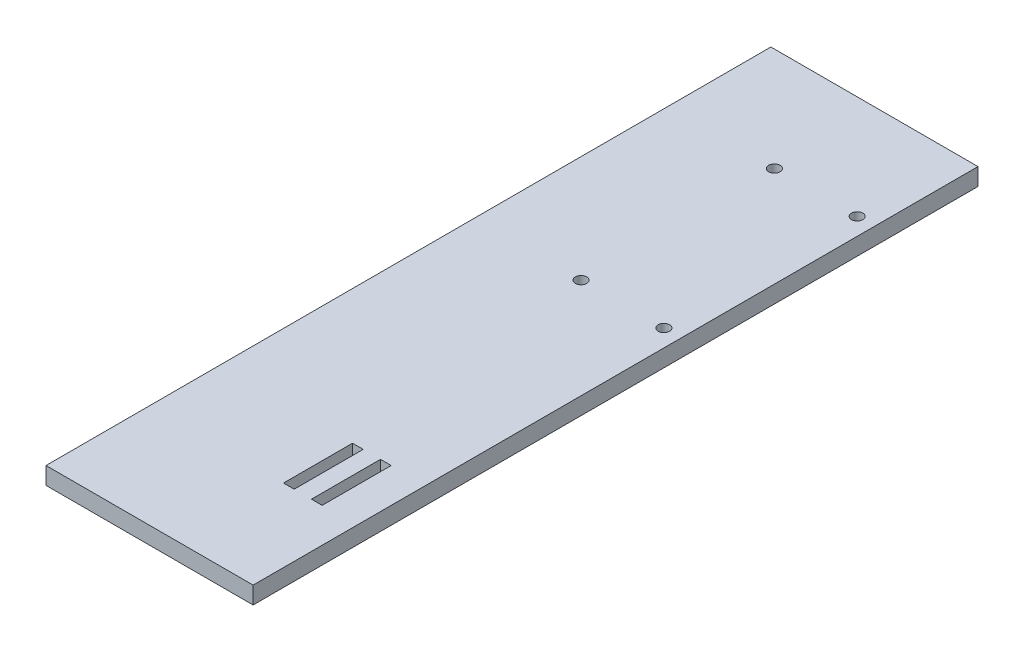
ISO-10303-21;
HEADER;
FILE_DESCRIPTION(('STEP AP214'),'2;1');
FILE_NAME('part.step','',(''),(''),'','','');
FILE_SCHEMA(('AUTOMOTIVE_DESIGN { 1 0 10303 214 1 1 1 1 }'));
ENDSEC;
DATA;
#1=APPLICATION_CONTEXT('core data for automotive mechanical design processes');
#2=APPLICATION_PROTOCOL_DEFINITION('international standard','automotive_design',2000,#1);
#3=PRODUCT_CONTEXT('',#1,'mechanical');
#4=PRODUCT('Part','Part','',(#3));
#5=PRODUCT_RELATED_PRODUCT_CATEGORY('part','',(#4));
#6=PRODUCT_DEFINITION_FORMATION('','',#4);
#7=PRODUCT_DEFINITION_CONTEXT('part definition',#1,'design');
#8=PRODUCT_DEFINITION('design','',#6,#7);
#9=PRODUCT_DEFINITION_SHAPE('','',#8);
#10=(LENGTH_UNIT() NAMED_UNIT(*) SI_UNIT(.MILLI.,.METRE.));
#11=(NAMED_UNIT(*) PLANE_ANGLE_UNIT() SI_UNIT($,.RADIAN.));
#12=(NAMED_UNIT(*) SI_UNIT($,.STERADIAN.) SOLID_ANGLE_UNIT());
#13=UNCERTAINTY_MEASURE_WITH_UNIT(LENGTH_MEASURE(1.E-05),#10,'distance_accuracy_value','');
#14=(GEOMETRIC_REPRESENTATION_CONTEXT(3) GLOBAL_UNCERTAINTY_ASSIGNED_CONTEXT((#13)) GLOBAL_UNIT_ASSIGNED_CONTEXT((#10,
#11,#12)) REPRESENTATION_CONTEXT('',''));
#15=CARTESIAN_POINT('',(0.,0.,0.));
#16=DIRECTION('',(0.,0.,1.));
#17=DIRECTION('',(1.,0.,0.));
#18=AXIS2_PLACEMENT_3D('',#15,#16,#17);
#19=CARTESIAN_POINT('',(0.,5.,0.));
#20=DIRECTION('',(1.,0.,0.));
#21=DIRECTION('',(0.,0.,-1.));
#22=AXIS2_PLACEMENT_3D('',#19,#20,#21);
#23=PLANE('',#22);
#24=DIRECTION('',(0.,0.,1.));
#25=VECTOR('',#24,1.);
#26=CARTESIAN_POINT('',(0.,0.,0.));
#27=LINE('',#26,#25);
#28=CARTESIAN_POINT('',(0.,0.,-210.));
#29=VERTEX_POINT('',#28);
#30=CARTESIAN_POINT('',(0.,0.,0.));
#31=VERTEX_POINT('',#30);
#32=EDGE_CURVE('E177',#29,#31,#27,.T.);
#33=ORIENTED_EDGE('',*,*,#32,.T.);
#34=DIRECTION('',(0.,-1.,0.));
#35=VECTOR('',#34,1.);
#36=CARTESIAN_POINT('',(0.,5.,0.));
#37=LINE('',#36,#35);
#38=CARTESIAN_POINT('',(0.,5.,0.));
#39=VERTEX_POINT('',#38);
#40=EDGE_CURVE('E11',#39,#31,#37,.T.);
#41=ORIENTED_EDGE('',*,*,#40,.F.);
#42=DIRECTION('',(0.,0.,1.));
#43=VECTOR('',#42,1.);
#44=CARTESIAN_POINT('',(0.,5.,0.));
#45=LINE('',#44,#43);
#46=CARTESIAN_POINT('',(0.,5.,-210.));
#47=VERTEX_POINT('',#46);
#48=EDGE_CURVE('E225',#47,#39,#45,.T.);
#49=ORIENTED_EDGE('',*,*,#48,.F.);
#50=DIRECTION('',(0.,-1.,0.));
#51=VECTOR('',#50,1.);
#52=CARTESIAN_POINT('',(0.,5.,-210.));
#53=LINE('',#52,#51);
#54=EDGE_CURVE('E239',#47,#29,#53,.T.);
#55=ORIENTED_EDGE('',*,*,#54,.T.);
#56=EDGE_LOOP('',(#33,#41,#49,#55));
#57=FACE_BOUND('',#56,.T.);
#58=ADVANCED_FACE('F38',(#57),#23,.F.);
#59=CARTESIAN_POINT('',(0.,5.,0.));
#60=DIRECTION('',(0.,0.,-1.));
#61=DIRECTION('',(-1.,0.,0.));
#62=AXIS2_PLACEMENT_3D('',#59,#60,#61);
#63=PLANE('',#62);
#64=DIRECTION('',(1.,0.,0.));
#65=VECTOR('',#64,1.);
#66=CARTESIAN_POINT('',(0.,0.,0.));
#67=LINE('',#66,#65);
#68=CARTESIAN_POINT('',(60.,0.,0.));
#69=VERTEX_POINT('',#68);
#70=EDGE_CURVE('E243',#31,#69,#67,.T.);
#71=ORIENTED_EDGE('',*,*,#70,.T.);
#72=DIRECTION('',(0.,-1.,0.));
#73=VECTOR('',#72,1.);
#74=CARTESIAN_POINT('',(60.,5.,0.));
#75=LINE('',#74,#73);
#76=CARTESIAN_POINT('',(60.,5.,0.));
#77=VERTEX_POINT('',#76);
#78=EDGE_CURVE('E46',#77,#69,#75,.T.);
#79=ORIENTED_EDGE('',*,*,#78,.F.);
#80=DIRECTION('',(1.,0.,0.));
#81=VECTOR('',#80,1.);
#82=CARTESIAN_POINT('',(0.,5.,0.));
#83=LINE('',#82,#81);
#84=EDGE_CURVE('E229',#39,#77,#83,.T.);
#85=ORIENTED_EDGE('',*,*,#84,.F.);
#86=ORIENTED_EDGE('',*,*,#40,.T.);
#87=EDGE_LOOP('',(#71,#79,#85,#86));
#88=FACE_BOUND('',#87,.T.);
#89=ADVANCED_FACE('F278',(#88),#63,.F.);
#90=CARTESIAN_POINT('',(60.,5.,0.));
#91=DIRECTION('',(-1.,0.,0.));
#92=DIRECTION('',(0.,0.,1.));
#93=AXIS2_PLACEMENT_3D('',#90,#91,#92);
#94=PLANE('',#93);
#95=DIRECTION('',(0.,0.,-1.));
#96=VECTOR('',#95,1.);
#97=CARTESIAN_POINT('',(60.,0.,0.));
#98=LINE('',#97,#96);
#99=CARTESIAN_POINT('',(60.,0.,-210.));
#100=VERTEX_POINT('',#99);
#101=EDGE_CURVE('E246',#69,#100,#98,.T.);
#102=ORIENTED_EDGE('',*,*,#101,.T.);
#103=DIRECTION('',(0.,-1.,0.));
#104=VECTOR('',#103,1.);
#105=CARTESIAN_POINT('',(60.,5.,-210.));
#106=LINE('',#105,#104);
#107=CARTESIAN_POINT('',(60.,5.,-210.));
#108=VERTEX_POINT('',#107);
#109=EDGE_CURVE('E254',#108,#100,#106,.T.);
#110=ORIENTED_EDGE('',*,*,#109,.F.);
#111=DIRECTION('',(0.,0.,-1.));
#112=VECTOR('',#111,1.);
#113=CARTESIAN_POINT('',(60.,5.,0.));
#114=LINE('',#113,#112);
#115=EDGE_CURVE('E233',#77,#108,#114,.T.);
#116=ORIENTED_EDGE('',*,*,#115,.F.);
#117=ORIENTED_EDGE('',*,*,#78,.T.);
#118=EDGE_LOOP('',(#102,#110,#116,#117));
#119=FACE_BOUND('',#118,.T.);
#120=ADVANCED_FACE('F263',(#119),#94,.F.);
#121=CARTESIAN_POINT('',(0.,5.,-210.));
#122=DIRECTION('',(0.,0.,1.));
#123=DIRECTION('',(1.,0.,0.));
#124=AXIS2_PLACEMENT_3D('',#121,#122,#123);
#125=PLANE('',#124);
#126=DIRECTION('',(-1.,0.,0.));
#127=VECTOR('',#126,1.);
#128=CARTESIAN_POINT('',(0.,0.,-210.));
#129=LINE('',#128,#127);
#130=EDGE_CURVE('E230',#100,#29,#129,.T.);
#131=ORIENTED_EDGE('',*,*,#130,.T.);
#132=ORIENTED_EDGE('',*,*,#54,.F.);
#133=DIRECTION('',(-1.,0.,0.));
#134=VECTOR('',#133,1.);
#135=CARTESIAN_POINT('',(0.,5.,-210.));
#136=LINE('',#135,#134);
#137=EDGE_CURVE('E236',#108,#47,#136,.T.);
#138=ORIENTED_EDGE('',*,*,#137,.F.);
#139=ORIENTED_EDGE('',*,*,#109,.T.);
#140=EDGE_LOOP('',(#131,#132,#138,#139));
#141=FACE_BOUND('',#140,.T.);
#142=ADVANCED_FACE('F271',(#141),#125,.F.);
#143=CARTESIAN_POINT('',(0.,5.,0.));
#144=DIRECTION('',(0.,-1.,0.));
#145=DIRECTION('',(0.,0.,-1.));
#146=AXIS2_PLACEMENT_3D('',#143,#144,#145);
#147=PLANE('',#146);
#148=CARTESIAN_POINT('',(31.,5.,-180.));
#149=DIRECTION('',(0.,1.,0.));
#150=DIRECTION('',(0.,0.,-1.));
#151=AXIS2_PLACEMENT_3D('',#148,#149,#150);
#152=CIRCLE('',#151,1.65000000000001);
#153=CARTESIAN_POINT('',(31.,5.,-181.65));
#154=VERTEX_POINT('',#153);
#155=EDGE_CURVE('E363',#154,#154,#152,.T.);
#156=ORIENTED_EDGE('',*,*,#155,.F.);
#157=EDGE_LOOP('',(#156));
#158=FACE_BOUND('',#157,.T.);
#159=CARTESIAN_POINT('',(31.,5.,-124.));
#160=DIRECTION('',(0.,1.,0.));
#161=DIRECTION('',(0.,0.,1.));
#162=AXIS2_PLACEMENT_3D('',#159,#160,#161);
#163=CIRCLE('',#162,1.65);
#164=CARTESIAN_POINT('',(31.,5.,-122.35));
#165=VERTEX_POINT('',#164);
#166=EDGE_CURVE('E353',#165,#165,#163,.T.);
#167=ORIENTED_EDGE('',*,*,#166,.F.);
#168=EDGE_LOOP('',(#167));
#169=FACE_BOUND('',#168,.T.);
#170=CARTESIAN_POINT('',(55.,5.,-124.));
#171=DIRECTION('',(0.,1.,0.));
#172=DIRECTION('',(0.,0.,-1.));
#173=AXIS2_PLACEMENT_3D('',#170,#171,#172);
#174=CIRCLE('',#173,1.65);
#175=CARTESIAN_POINT('',(55.,5.,-125.65));
#176=VERTEX_POINT('',#175);
#177=EDGE_CURVE('E344',#176,#176,#174,.T.);
#178=ORIENTED_EDGE('',*,*,#177,.F.);
#179=EDGE_LOOP('',(#178));
#180=FACE_BOUND('',#179,.T.);
#181=CARTESIAN_POINT('',(55.,5.,-180.));
#182=DIRECTION('',(0.,1.,0.));
#183=DIRECTION('',(0.,0.,1.));
#184=AXIS2_PLACEMENT_3D('',#181,#182,#183);
#185=CIRCLE('',#184,1.65000000000001);
#186=CARTESIAN_POINT('',(55.,5.,-178.35));
#187=VERTEX_POINT('',#186);
#188=EDGE_CURVE('E158',#187,#187,#185,.T.);
#189=ORIENTED_EDGE('',*,*,#188,.F.);
#190=EDGE_LOOP('',(#189));
#191=FACE_BOUND('',#190,.T.);
#192=DIRECTION('',(1.,0.,0.));
#193=VECTOR('',#192,1.);
#194=CARTESIAN_POINT('',(46.9,5.,-30.));
#195=LINE('',#194,#193);
#196=CARTESIAN_POINT('',(46.9,5.,-30.));
#197=VERTEX_POINT('',#196);
#198=CARTESIAN_POINT('',(50.,5.,-30.));
#199=VERTEX_POINT('',#198);
#200=EDGE_CURVE('E167',#197,#199,#195,.T.);
#201=ORIENTED_EDGE('',*,*,#200,.F.);
#202=DIRECTION('',(0.,0.,1.));
#203=VECTOR('',#202,1.);
#204=CARTESIAN_POINT('',(46.9,5.,-30.));
#205=LINE('',#204,#203);
#206=CARTESIAN_POINT('',(46.9,5.,-50.));
#207=VERTEX_POINT('',#206);
#208=EDGE_CURVE('E53',#207,#197,#205,.T.);
#209=ORIENTED_EDGE('',*,*,#208,.F.);
#210=DIRECTION('',(-1.,0.,0.));
#211=VECTOR('',#210,1.);
#212=CARTESIAN_POINT('',(46.9,5.,-50.));
#213=LINE('',#212,#211);
#214=CARTESIAN_POINT('',(50.,5.,-50.));
#215=VERTEX_POINT('',#214);
#216=EDGE_CURVE('E151',#215,#207,#213,.T.);
#217=ORIENTED_EDGE('',*,*,#216,.F.);
#218=DIRECTION('',(0.,0.,-1.));
#219=VECTOR('',#218,1.);
#220=CARTESIAN_POINT('',(50.,5.,-30.));
#221=LINE('',#220,#219);
#222=EDGE_CURVE('E155',#199,#215,#221,.T.);
#223=ORIENTED_EDGE('',*,*,#222,.F.);
#224=EDGE_LOOP('',(#201,#209,#217,#223));
#225=FACE_BOUND('',#224,.T.);
#226=DIRECTION('',(1.,0.,0.));
#227=VECTOR('',#226,1.);
#228=CARTESIAN_POINT('',(38.8,5.,-30.));
#229=LINE('',#228,#227);
#230=CARTESIAN_POINT('',(38.8,5.,-30.));
#231=VERTEX_POINT('',#230);
#232=CARTESIAN_POINT('',(41.9,5.,-30.));
#233=VERTEX_POINT('',#232);
#234=EDGE_CURVE('E203',#231,#233,#229,.T.);
#235=ORIENTED_EDGE('',*,*,#234,.F.);
#236=DIRECTION('',(0.,0.,1.));
#237=VECTOR('',#236,1.);
#238=CARTESIAN_POINT('',(38.8,5.,-50.));
#239=LINE('',#238,#237);
#240=CARTESIAN_POINT('',(38.8,5.,-50.));
#241=VERTEX_POINT('',#240);
#242=EDGE_CURVE('E61',#241,#231,#239,.T.);
#243=ORIENTED_EDGE('',*,*,#242,.F.);
#244=DIRECTION('',(-1.,0.,0.));
#245=VECTOR('',#244,1.);
#246=CARTESIAN_POINT('',(38.8,5.,-50.));
#247=LINE('',#246,#245);
#248=CARTESIAN_POINT('',(41.9,5.,-50.));
#249=VERTEX_POINT('',#248);
#250=EDGE_CURVE('E188',#249,#241,#247,.T.);
#251=ORIENTED_EDGE('',*,*,#250,.F.);
#252=DIRECTION('',(0.,0.,-1.));
#253=VECTOR('',#252,1.);
#254=CARTESIAN_POINT('',(41.9,5.,-50.));
#255=LINE('',#254,#253);
#256=EDGE_CURVE('E208',#233,#249,#255,.T.);
#257=ORIENTED_EDGE('',*,*,#256,.F.);
#258=EDGE_LOOP('',(#235,#243,#251,#257));
#259=FACE_BOUND('',#258,.T.);
#260=ORIENTED_EDGE('',*,*,#48,.T.);
#261=ORIENTED_EDGE('',*,*,#84,.T.);
#262=ORIENTED_EDGE('',*,*,#115,.T.);
#263=ORIENTED_EDGE('',*,*,#137,.T.);
#264=EDGE_LOOP('',(#260,#261,#262,#263));
#265=FACE_BOUND('',#264,.T.);
#266=ADVANCED_FACE('F277',(#158,#169,#180,#191,#225,#259,#265),#147,.F.);
#267=CARTESIAN_POINT('',(0.,0.,0.));
#268=DIRECTION('',(0.,-1.,0.));
#269=DIRECTION('',(0.,0.,-1.));
#270=AXIS2_PLACEMENT_3D('',#267,#268,#269);
#271=PLANE('',#270);
#272=CARTESIAN_POINT('',(31.,0.,-180.));
#273=DIRECTION('',(0.,1.,0.));
#274=DIRECTION('',(0.,0.,-1.));
#275=AXIS2_PLACEMENT_3D('',#272,#273,#274);
#276=CIRCLE('',#275,1.65000000000001);
#277=CARTESIAN_POINT('',(31.,0.,-181.65));
#278=VERTEX_POINT('',#277);
#279=EDGE_CURVE('E359',#278,#278,#276,.T.);
#280=ORIENTED_EDGE('',*,*,#279,.T.);
#281=EDGE_LOOP('',(#280));
#282=FACE_BOUND('',#281,.T.);
#283=CARTESIAN_POINT('',(31.,0.,-124.));
#284=DIRECTION('',(0.,1.,0.));
#285=DIRECTION('',(0.,0.,1.));
#286=AXIS2_PLACEMENT_3D('',#283,#284,#285);
#287=CIRCLE('',#286,1.65);
#288=CARTESIAN_POINT('',(31.,0.,-122.35));
#289=VERTEX_POINT('',#288);
#290=EDGE_CURVE('E347',#289,#289,#287,.T.);
#291=ORIENTED_EDGE('',*,*,#290,.T.);
#292=EDGE_LOOP('',(#291));
#293=FACE_BOUND('',#292,.T.);
#294=CARTESIAN_POINT('',(55.,0.,-124.));
#295=DIRECTION('',(0.,1.,0.));
#296=DIRECTION('',(0.,0.,-1.));
#297=AXIS2_PLACEMENT_3D('',#294,#295,#296);
#298=CIRCLE('',#297,1.65);
#299=CARTESIAN_POINT('',(55.,0.,-125.65));
#300=VERTEX_POINT('',#299);
#301=EDGE_CURVE('E341',#300,#300,#298,.T.);
#302=ORIENTED_EDGE('',*,*,#301,.T.);
#303=EDGE_LOOP('',(#302));
#304=FACE_BOUND('',#303,.T.);
#305=CARTESIAN_POINT('',(55.,0.,-180.));
#306=DIRECTION('',(0.,1.,0.));
#307=DIRECTION('',(0.,0.,1.));
#308=AXIS2_PLACEMENT_3D('',#305,#306,#307);
#309=CIRCLE('',#308,1.65000000000001);
#310=CARTESIAN_POINT('',(55.,0.,-178.35));
#311=VERTEX_POINT('',#310);
#312=EDGE_CURVE('E204',#311,#311,#309,.T.);
#313=ORIENTED_EDGE('',*,*,#312,.T.);
#314=EDGE_LOOP('',(#313));
#315=FACE_BOUND('',#314,.T.);
#316=DIRECTION('',(0.,0.,1.));
#317=VECTOR('',#316,1.);
#318=CARTESIAN_POINT('',(46.9,0.,-30.));
#319=LINE('',#318,#317);
#320=CARTESIAN_POINT('',(46.9,0.,-50.));
#321=VERTEX_POINT('',#320);
#322=CARTESIAN_POINT('',(46.9,0.,-30.));
#323=VERTEX_POINT('',#322);
#324=EDGE_CURVE('E129',#321,#323,#319,.T.);
#325=ORIENTED_EDGE('',*,*,#324,.T.);
#326=DIRECTION('',(1.,0.,0.));
#327=VECTOR('',#326,1.);
#328=CARTESIAN_POINT('',(46.9,0.,-30.));
#329=LINE('',#328,#327);
#330=CARTESIAN_POINT('',(50.,0.,-30.));
#331=VERTEX_POINT('',#330);
#332=EDGE_CURVE('E140',#323,#331,#329,.T.);
#333=ORIENTED_EDGE('',*,*,#332,.T.);
#334=DIRECTION('',(0.,0.,-1.));
#335=VECTOR('',#334,1.);
#336=CARTESIAN_POINT('',(50.,0.,-30.));
#337=LINE('',#336,#335);
#338=CARTESIAN_POINT('',(50.,0.,-50.));
#339=VERTEX_POINT('',#338);
#340=EDGE_CURVE('E145',#331,#339,#337,.T.);
#341=ORIENTED_EDGE('',*,*,#340,.T.);
#342=DIRECTION('',(-1.,0.,0.));
#343=VECTOR('',#342,1.);
#344=CARTESIAN_POINT('',(46.9,0.,-50.));
#345=LINE('',#344,#343);
#346=EDGE_CURVE('E136',#339,#321,#345,.T.);
#347=ORIENTED_EDGE('',*,*,#346,.T.);
#348=EDGE_LOOP('',(#325,#333,#341,#347));
#349=FACE_BOUND('',#348,.T.);
#350=DIRECTION('',(0.,0.,1.));
#351=VECTOR('',#350,1.);
#352=CARTESIAN_POINT('',(38.8,0.,-50.));
#353=LINE('',#352,#351);
#354=CARTESIAN_POINT('',(38.8,0.,-50.));
#355=VERTEX_POINT('',#354);
#356=CARTESIAN_POINT('',(38.8,0.,-30.));
#357=VERTEX_POINT('',#356);
#358=EDGE_CURVE('E183',#355,#357,#353,.T.);
#359=ORIENTED_EDGE('',*,*,#358,.T.);
#360=DIRECTION('',(1.,0.,0.));
#361=VECTOR('',#360,1.);
#362=CARTESIAN_POINT('',(38.8,0.,-30.));
#363=LINE('',#362,#361);
#364=CARTESIAN_POINT('',(41.9,0.,-30.));
#365=VERTEX_POINT('',#364);
#366=EDGE_CURVE('E187',#357,#365,#363,.T.);
#367=ORIENTED_EDGE('',*,*,#366,.T.);
#368=DIRECTION('',(0.,0.,-1.));
#369=VECTOR('',#368,1.);
#370=CARTESIAN_POINT('',(41.9,0.,-50.));
#371=LINE('',#370,#369);
#372=CARTESIAN_POINT('',(41.9,0.,-50.));
#373=VERTEX_POINT('',#372);
#374=EDGE_CURVE('E192',#365,#373,#371,.T.);
#375=ORIENTED_EDGE('',*,*,#374,.T.);
#376=DIRECTION('',(-1.,0.,0.));
#377=VECTOR('',#376,1.);
#378=CARTESIAN_POINT('',(38.8,0.,-50.));
#379=LINE('',#378,#377);
#380=EDGE_CURVE('E196',#373,#355,#379,.T.);
#381=ORIENTED_EDGE('',*,*,#380,.T.);
#382=EDGE_LOOP('',(#359,#367,#375,#381));
#383=FACE_BOUND('',#382,.T.);
#384=ORIENTED_EDGE('',*,*,#32,.F.);
#385=ORIENTED_EDGE('',*,*,#130,.F.);
#386=ORIENTED_EDGE('',*,*,#101,.F.);
#387=ORIENTED_EDGE('',*,*,#70,.F.);
#388=EDGE_LOOP('',(#384,#385,#386,#387));
#389=FACE_BOUND('',#388,.T.);
#390=ADVANCED_FACE('F147',(#282,#293,#304,#315,#349,#383,#389),#271,.T.);
#391=CARTESIAN_POINT('',(38.8,0.,-50.));
#392=DIRECTION('',(-1.,0.,0.));
#393=DIRECTION('',(0.,0.,1.));
#394=AXIS2_PLACEMENT_3D('',#391,#392,#393);
#395=PLANE('',#394);
#396=ORIENTED_EDGE('',*,*,#242,.T.);
#397=DIRECTION('',(0.,1.,0.));
#398=VECTOR('',#397,1.);
#399=CARTESIAN_POINT('',(38.8,0.,-30.));
#400=LINE('',#399,#398);
#401=EDGE_CURVE('E200',#357,#231,#400,.T.);
#402=ORIENTED_EDGE('',*,*,#401,.F.);
#403=ORIENTED_EDGE('',*,*,#358,.F.);
#404=DIRECTION('',(0.,1.,0.));
#405=VECTOR('',#404,1.);
#406=CARTESIAN_POINT('',(38.8,0.,-50.));
#407=LINE('',#406,#405);
#408=EDGE_CURVE('E168',#355,#241,#407,.T.);
#409=ORIENTED_EDGE('',*,*,#408,.T.);
#410=EDGE_LOOP('',(#396,#402,#403,#409));
#411=FACE_BOUND('',#410,.T.);
#412=ADVANCED_FACE('F290',(#411),#395,.F.);
#413=CARTESIAN_POINT('',(38.8,0.,-50.));
#414=DIRECTION('',(0.,0.,-1.));
#415=DIRECTION('',(-1.,0.,0.));
#416=AXIS2_PLACEMENT_3D('',#413,#414,#415);
#417=PLANE('',#416);
#418=ORIENTED_EDGE('',*,*,#250,.T.);
#419=ORIENTED_EDGE('',*,*,#408,.F.);
#420=ORIENTED_EDGE('',*,*,#380,.F.);
#421=DIRECTION('',(0.,1.,0.));
#422=VECTOR('',#421,1.);
#423=CARTESIAN_POINT('',(41.9,0.,-50.));
#424=LINE('',#423,#422);
#425=EDGE_CURVE('E217',#373,#249,#424,.T.);
#426=ORIENTED_EDGE('',*,*,#425,.T.);
#427=EDGE_LOOP('',(#418,#419,#420,#426));
#428=FACE_BOUND('',#427,.T.);
#429=ADVANCED_FACE('F297',(#428),#417,.F.);
#430=CARTESIAN_POINT('',(41.9,0.,-50.));
#431=DIRECTION('',(1.,0.,0.));
#432=DIRECTION('',(0.,0.,-1.));
#433=AXIS2_PLACEMENT_3D('',#430,#431,#432);
#434=PLANE('',#433);
#435=ORIENTED_EDGE('',*,*,#256,.T.);
#436=ORIENTED_EDGE('',*,*,#425,.F.);
#437=ORIENTED_EDGE('',*,*,#374,.F.);
#438=DIRECTION('',(0.,1.,0.));
#439=VECTOR('',#438,1.);
#440=CARTESIAN_POINT('',(41.9,0.,-30.));
#441=LINE('',#440,#439);
#442=EDGE_CURVE('E220',#365,#233,#441,.T.);
#443=ORIENTED_EDGE('',*,*,#442,.T.);
#444=EDGE_LOOP('',(#435,#436,#437,#443));
#445=FACE_BOUND('',#444,.T.);
#446=ADVANCED_FACE('F301',(#445),#434,.F.);
#447=CARTESIAN_POINT('',(38.8,0.,-30.));
#448=DIRECTION('',(0.,0.,1.));
#449=DIRECTION('',(1.,0.,0.));
#450=AXIS2_PLACEMENT_3D('',#447,#448,#449);
#451=PLANE('',#450);
#452=ORIENTED_EDGE('',*,*,#234,.T.);
#453=ORIENTED_EDGE('',*,*,#442,.F.);
#454=ORIENTED_EDGE('',*,*,#366,.F.);
#455=ORIENTED_EDGE('',*,*,#401,.T.);
#456=EDGE_LOOP('',(#452,#453,#454,#455));
#457=FACE_BOUND('',#456,.T.);
#458=ADVANCED_FACE('F298',(#457),#451,.F.);
#459=CARTESIAN_POINT('',(46.9,0.,-30.));
#460=DIRECTION('',(-1.,0.,0.));
#461=DIRECTION('',(0.,0.,1.));
#462=AXIS2_PLACEMENT_3D('',#459,#460,#461);
#463=PLANE('',#462);
#464=ORIENTED_EDGE('',*,*,#208,.T.);
#465=DIRECTION('',(0.,1.,0.));
#466=VECTOR('',#465,1.);
#467=CARTESIAN_POINT('',(46.9,0.,-30.));
#468=LINE('',#467,#466);
#469=EDGE_CURVE('E125',#323,#197,#468,.T.);
#470=ORIENTED_EDGE('',*,*,#469,.F.);
#471=ORIENTED_EDGE('',*,*,#324,.F.);
#472=DIRECTION('',(0.,1.,0.));
#473=VECTOR('',#472,1.);
#474=CARTESIAN_POINT('',(46.9,0.,-50.));
#475=LINE('',#474,#473);
#476=EDGE_CURVE('E174',#321,#207,#475,.T.);
#477=ORIENTED_EDGE('',*,*,#476,.T.);
#478=EDGE_LOOP('',(#464,#470,#471,#477));
#479=FACE_BOUND('',#478,.T.);
#480=ADVANCED_FACE('F127',(#479),#463,.F.);
#481=CARTESIAN_POINT('',(46.9,0.,-50.));
#482=DIRECTION('',(0.,0.,-1.));
#483=DIRECTION('',(-1.,0.,0.));
#484=AXIS2_PLACEMENT_3D('',#481,#482,#483);
#485=PLANE('',#484);
#486=ORIENTED_EDGE('',*,*,#216,.T.);
#487=ORIENTED_EDGE('',*,*,#476,.F.);
#488=ORIENTED_EDGE('',*,*,#346,.F.);
#489=DIRECTION('',(0.,1.,0.));
#490=VECTOR('',#489,1.);
#491=CARTESIAN_POINT('',(50.,0.,-50.));
#492=LINE('',#491,#490);
#493=EDGE_CURVE('E178',#339,#215,#492,.T.);
#494=ORIENTED_EDGE('',*,*,#493,.T.);
#495=EDGE_LOOP('',(#486,#487,#488,#494));
#496=FACE_BOUND('',#495,.T.);
#497=ADVANCED_FACE('F311',(#496),#485,.F.);
#498=CARTESIAN_POINT('',(50.,0.,-30.));
#499=DIRECTION('',(1.,0.,0.));
#500=DIRECTION('',(0.,0.,-1.));
#501=AXIS2_PLACEMENT_3D('',#498,#499,#500);
#502=PLANE('',#501);
#503=ORIENTED_EDGE('',*,*,#222,.T.);
#504=ORIENTED_EDGE('',*,*,#493,.F.);
#505=ORIENTED_EDGE('',*,*,#340,.F.);
#506=DIRECTION('',(0.,1.,0.));
#507=VECTOR('',#506,1.);
#508=CARTESIAN_POINT('',(50.,0.,-30.));
#509=LINE('',#508,#507);
#510=EDGE_CURVE('E135',#331,#199,#509,.T.);
#511=ORIENTED_EDGE('',*,*,#510,.T.);
#512=EDGE_LOOP('',(#503,#504,#505,#511));
#513=FACE_BOUND('',#512,.T.);
#514=ADVANCED_FACE('F315',(#513),#502,.F.);
#515=CARTESIAN_POINT('',(46.9,0.,-30.));
#516=DIRECTION('',(0.,0.,1.));
#517=DIRECTION('',(1.,0.,0.));
#518=AXIS2_PLACEMENT_3D('',#515,#516,#517);
#519=PLANE('',#518);
#520=ORIENTED_EDGE('',*,*,#200,.T.);
#521=ORIENTED_EDGE('',*,*,#510,.F.);
#522=ORIENTED_EDGE('',*,*,#332,.F.);
#523=ORIENTED_EDGE('',*,*,#469,.T.);
#524=EDGE_LOOP('',(#520,#521,#522,#523));
#525=FACE_BOUND('',#524,.T.);
#526=ADVANCED_FACE('F141',(#525),#519,.F.);
#527=CARTESIAN_POINT('',(55.,0.,-180.));
#528=DIRECTION('',(0.,1.,0.));
#529=DIRECTION('',(0.,0.,1.));
#530=AXIS2_PLACEMENT_3D('',#527,#528,#529);
#531=CYLINDRICAL_SURFACE('',#530,1.65000000000001);
#532=ORIENTED_EDGE('',*,*,#312,.F.);
#533=EDGE_LOOP('',(#532));
#534=FACE_BOUND('',#533,.T.);
#535=ORIENTED_EDGE('',*,*,#188,.T.);
#536=EDGE_LOOP('',(#535));
#537=FACE_BOUND('',#536,.T.);
#538=ADVANCED_FACE('F314',(#534,#537),#531,.F.);
#539=CARTESIAN_POINT('',(55.,0.,-124.));
#540=DIRECTION('',(0.,1.,0.));
#541=DIRECTION('',(0.,0.,1.));
#542=AXIS2_PLACEMENT_3D('',#539,#540,#541);
#543=CYLINDRICAL_SURFACE('',#542,1.65);
#544=ORIENTED_EDGE('',*,*,#301,.F.);
#545=EDGE_LOOP('',(#544));
#546=FACE_BOUND('',#545,.T.);
#547=ORIENTED_EDGE('',*,*,#177,.T.);
#548=EDGE_LOOP('',(#547));
#549=FACE_BOUND('',#548,.T.);
#550=ADVANCED_FACE('F324',(#546,#549),#543,.F.);
#551=CARTESIAN_POINT('',(31.,0.,-124.));
#552=DIRECTION('',(0.,1.,0.));
#553=DIRECTION('',(0.,0.,1.));
#554=AXIS2_PLACEMENT_3D('',#551,#552,#553);
#555=CYLINDRICAL_SURFACE('',#554,1.65);
#556=ORIENTED_EDGE('',*,*,#290,.F.);
#557=EDGE_LOOP('',(#556));
#558=FACE_BOUND('',#557,.T.);
#559=ORIENTED_EDGE('',*,*,#166,.T.);
#560=EDGE_LOOP('',(#559));
#561=FACE_BOUND('',#560,.T.);
#562=ADVANCED_FACE('F329',(#558,#561),#555,.F.);
#563=CARTESIAN_POINT('',(31.,0.,-180.));
#564=DIRECTION('',(0.,1.,0.));
#565=DIRECTION('',(0.,0.,1.));
#566=AXIS2_PLACEMENT_3D('',#563,#564,#565);
#567=CYLINDRICAL_SURFACE('',#566,1.65000000000001);
#568=ORIENTED_EDGE('',*,*,#279,.F.);
#569=EDGE_LOOP('',(#568));
#570=FACE_BOUND('',#569,.T.);
#571=ORIENTED_EDGE('',*,*,#155,.T.);
#572=EDGE_LOOP('',(#571));
#573=FACE_BOUND('',#572,.T.);
#574=ADVANCED_FACE('F326',(#570,#573),#567,.F.);
#575=CLOSED_SHELL('',(#58,#89,#120,#142,#266,#390,#412,#429,#446,#458,#480,#497,#514,#526,#538,
#550,#562,#574));
#576=MANIFOLD_SOLID_BREP('B2',#575);
#577=ADVANCED_BREP_SHAPE_REPRESENTATION('',(#18,#576),#14);
#578=SHAPE_DEFINITION_REPRESENTATION(#9,#577);
ENDSEC;
END-ISO-10303-21;
